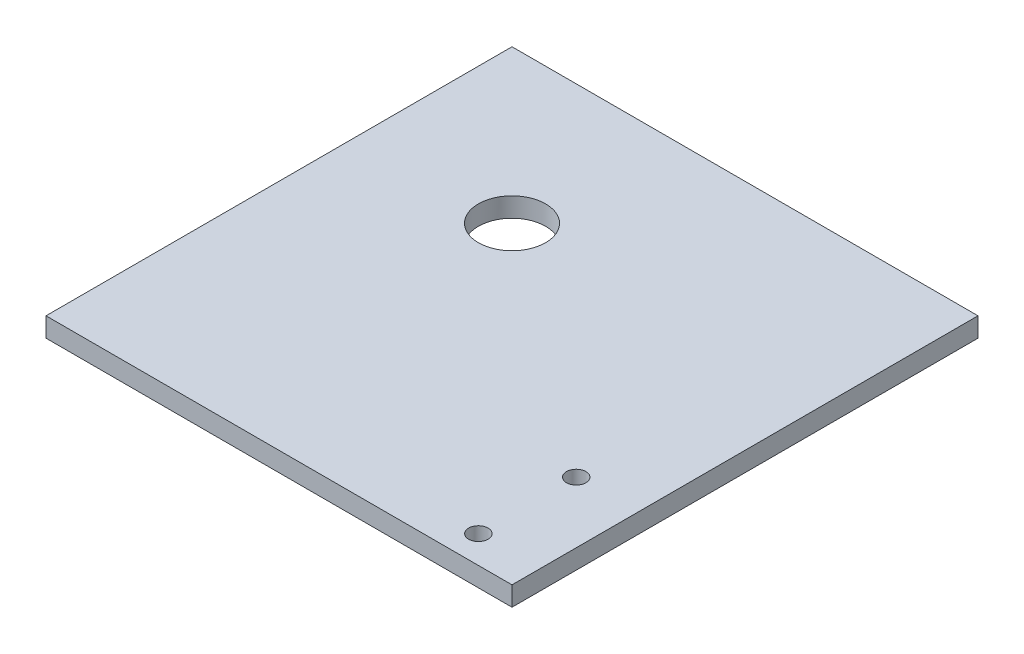
ISO-10303-21;
HEADER;
FILE_DESCRIPTION(('STEP AP214'),'2;1');
FILE_NAME('part.step','',(''),(''),'','','');
FILE_SCHEMA(('AUTOMOTIVE_DESIGN { 1 0 10303 214 1 1 1 1 }'));
ENDSEC;
DATA;
#1=APPLICATION_CONTEXT('core data for automotive mechanical design processes');
#2=APPLICATION_PROTOCOL_DEFINITION('international standard','automotive_design',2000,#1);
#3=PRODUCT_CONTEXT('',#1,'mechanical');
#4=PRODUCT('Part','Part','',(#3));
#5=PRODUCT_RELATED_PRODUCT_CATEGORY('part','',(#4));
#6=PRODUCT_DEFINITION_FORMATION('','',#4);
#7=PRODUCT_DEFINITION_CONTEXT('part definition',#1,'design');
#8=PRODUCT_DEFINITION('design','',#6,#7);
#9=PRODUCT_DEFINITION_SHAPE('','',#8);
#10=(LENGTH_UNIT() NAMED_UNIT(*) SI_UNIT(.MILLI.,.METRE.));
#11=(NAMED_UNIT(*) PLANE_ANGLE_UNIT() SI_UNIT($,.RADIAN.));
#12=(NAMED_UNIT(*) SI_UNIT($,.STERADIAN.) SOLID_ANGLE_UNIT());
#13=UNCERTAINTY_MEASURE_WITH_UNIT(LENGTH_MEASURE(1.E-05),#10,'distance_accuracy_value','');
#14=(GEOMETRIC_REPRESENTATION_CONTEXT(3) GLOBAL_UNCERTAINTY_ASSIGNED_CONTEXT((#13)) GLOBAL_UNIT_ASSIGNED_CONTEXT((#10,
#11,#12)) REPRESENTATION_CONTEXT('',''));
#15=CARTESIAN_POINT('',(0.,0.,0.));
#16=DIRECTION('',(0.,0.,1.));
#17=DIRECTION('',(1.,0.,0.));
#18=AXIS2_PLACEMENT_3D('',#15,#16,#17);
#19=CARTESIAN_POINT('',(0.,3.175,0.));
#20=DIRECTION('',(0.,-1.,0.));
#21=DIRECTION('',(0.,0.,-1.));
#22=AXIS2_PLACEMENT_3D('',#19,#20,#21);
#23=PLANE('',#22);
#24=DIRECTION('',(0.,0.,-1.));
#25=VECTOR('',#24,1.);
#26=CARTESIAN_POINT('',(76.2,3.175,76.2));
#27=LINE('',#26,#25);
#28=CARTESIAN_POINT('',(76.2,3.175,76.2));
#29=VERTEX_POINT('',#28);
#30=CARTESIAN_POINT('',(76.2,3.175,-76.2));
#31=VERTEX_POINT('',#30);
#32=EDGE_CURVE('E99',#29,#31,#27,.T.);
#33=ORIENTED_EDGE('',*,*,#32,.T.);
#34=DIRECTION('',(-1.,0.,0.));
#35=VECTOR('',#34,1.);
#36=CARTESIAN_POINT('',(-76.2,3.175,-76.2));
#37=LINE('',#36,#35);
#38=CARTESIAN_POINT('',(-76.2,3.175,-76.2));
#39=VERTEX_POINT('',#38);
#40=EDGE_CURVE('E94',#31,#39,#37,.T.);
#41=ORIENTED_EDGE('',*,*,#40,.T.);
#42=DIRECTION('',(0.,0.,1.));
#43=VECTOR('',#42,1.);
#44=CARTESIAN_POINT('',(-76.2,3.175,76.2));
#45=LINE('',#44,#43);
#46=CARTESIAN_POINT('',(-76.2,3.175,76.2));
#47=VERTEX_POINT('',#46);
#48=EDGE_CURVE('E97',#39,#47,#45,.T.);
#49=ORIENTED_EDGE('',*,*,#48,.T.);
#50=DIRECTION('',(1.,0.,0.));
#51=VECTOR('',#50,1.);
#52=CARTESIAN_POINT('',(-76.2,3.175,76.2));
#53=LINE('',#52,#51);
#54=EDGE_CURVE('E64',#47,#29,#53,.T.);
#55=ORIENTED_EDGE('',*,*,#54,.T.);
#56=EDGE_LOOP('',(#33,#41,#49,#55));
#57=FACE_BOUND('',#56,.T.);
#58=CARTESIAN_POINT('',(-26.2,3.175,-26.2));
#59=DIRECTION('',(0.,1.,0.));
#60=DIRECTION('',(0.,0.,1.));
#61=AXIS2_PLACEMENT_3D('',#58,#59,#60);
#62=CIRCLE('',#61,11.);
#63=CARTESIAN_POINT('',(-26.2,3.175,-15.2));
#64=VERTEX_POINT('',#63);
#65=EDGE_CURVE('E122',#64,#64,#62,.T.);
#66=ORIENTED_EDGE('',*,*,#65,.F.);
#67=EDGE_LOOP('',(#66));
#68=FACE_BOUND('',#67,.T.);
#69=CARTESIAN_POINT('',(56.2,3.175,67.2));
#70=DIRECTION('',(0.,1.,0.));
#71=DIRECTION('',(0.,0.,1.));
#72=AXIS2_PLACEMENT_3D('',#69,#70,#71);
#73=CIRCLE('',#72,3.175);
#74=CARTESIAN_POINT('',(56.2,3.175,70.375));
#75=VERTEX_POINT('',#74);
#76=EDGE_CURVE('E130',#75,#75,#73,.F.);
#77=ORIENTED_EDGE('',*,*,#76,.T.);
#78=EDGE_LOOP('',(#77));
#79=FACE_BOUND('',#78,.T.);
#80=CARTESIAN_POINT('',(56.2,3.175,35.2));
#81=DIRECTION('',(0.,1.,0.));
#82=DIRECTION('',(0.,0.,1.));
#83=AXIS2_PLACEMENT_3D('',#80,#81,#82);
#84=CIRCLE('',#83,3.175);
#85=CARTESIAN_POINT('',(56.2,3.175,38.375));
#86=VERTEX_POINT('',#85);
#87=EDGE_CURVE('E125',#86,#86,#84,.T.);
#88=ORIENTED_EDGE('',*,*,#87,.F.);
#89=EDGE_LOOP('',(#88));
#90=FACE_BOUND('',#89,.T.);
#91=ADVANCED_FACE('F45',(#57,#68,#79,#90),#23,.F.);
#92=CARTESIAN_POINT('',(0.,-3.175,0.));
#93=DIRECTION('',(0.,-1.,0.));
#94=DIRECTION('',(0.,0.,-1.));
#95=AXIS2_PLACEMENT_3D('',#92,#93,#94);
#96=PLANE('',#95);
#97=CARTESIAN_POINT('',(56.2,-3.175,67.2));
#98=DIRECTION('',(0.,-1.,0.));
#99=DIRECTION('',(0.,0.,-1.));
#100=AXIS2_PLACEMENT_3D('',#97,#98,#99);
#101=CIRCLE('',#100,3.175);
#102=CARTESIAN_POINT('',(56.2,-3.175,64.025));
#103=VERTEX_POINT('',#102);
#104=EDGE_CURVE('E123',#103,#103,#101,.F.);
#105=ORIENTED_EDGE('',*,*,#104,.T.);
#106=EDGE_LOOP('',(#105));
#107=FACE_BOUND('',#106,.T.);
#108=CARTESIAN_POINT('',(-26.2,-3.175,-26.2));
#109=DIRECTION('',(0.,-1.,0.));
#110=DIRECTION('',(0.,0.,-1.));
#111=AXIS2_PLACEMENT_3D('',#108,#109,#110);
#112=CIRCLE('',#111,11.);
#113=CARTESIAN_POINT('',(-26.2,-3.175,-37.2));
#114=VERTEX_POINT('',#113);
#115=EDGE_CURVE('E115',#114,#114,#112,.T.);
#116=ORIENTED_EDGE('',*,*,#115,.F.);
#117=EDGE_LOOP('',(#116));
#118=FACE_BOUND('',#117,.T.);
#119=DIRECTION('',(0.,0.,-1.));
#120=VECTOR('',#119,1.);
#121=CARTESIAN_POINT('',(76.2,-3.175,76.2));
#122=LINE('',#121,#120);
#123=CARTESIAN_POINT('',(76.2,-3.175,76.2));
#124=VERTEX_POINT('',#123);
#125=CARTESIAN_POINT('',(76.2,-3.175,-76.2));
#126=VERTEX_POINT('',#125);
#127=EDGE_CURVE('E112',#124,#126,#122,.T.);
#128=ORIENTED_EDGE('',*,*,#127,.F.);
#129=DIRECTION('',(1.,0.,0.));
#130=VECTOR('',#129,1.);
#131=CARTESIAN_POINT('',(-76.2,-3.175,76.2));
#132=LINE('',#131,#130);
#133=CARTESIAN_POINT('',(-76.2,-3.175,76.2));
#134=VERTEX_POINT('',#133);
#135=EDGE_CURVE('E87',#134,#124,#132,.T.);
#136=ORIENTED_EDGE('',*,*,#135,.F.);
#137=DIRECTION('',(0.,0.,1.));
#138=VECTOR('',#137,1.);
#139=CARTESIAN_POINT('',(-76.2,-3.175,76.2));
#140=LINE('',#139,#138);
#141=CARTESIAN_POINT('',(-76.2,-3.175,-76.2));
#142=VERTEX_POINT('',#141);
#143=EDGE_CURVE('E81',#142,#134,#140,.T.);
#144=ORIENTED_EDGE('',*,*,#143,.F.);
#145=DIRECTION('',(-1.,0.,0.));
#146=VECTOR('',#145,1.);
#147=CARTESIAN_POINT('',(-76.2,-3.175,-76.2));
#148=LINE('',#147,#146);
#149=EDGE_CURVE('E103',#126,#142,#148,.T.);
#150=ORIENTED_EDGE('',*,*,#149,.F.);
#151=EDGE_LOOP('',(#128,#136,#144,#150));
#152=FACE_BOUND('',#151,.T.);
#153=CARTESIAN_POINT('',(56.2,-3.175,35.2));
#154=DIRECTION('',(0.,-1.,0.));
#155=DIRECTION('',(0.,0.,-1.));
#156=AXIS2_PLACEMENT_3D('',#153,#154,#155);
#157=CIRCLE('',#156,3.175);
#158=CARTESIAN_POINT('',(56.2,-3.175,32.025));
#159=VERTEX_POINT('',#158);
#160=EDGE_CURVE('E49',#159,#159,#157,.T.);
#161=ORIENTED_EDGE('',*,*,#160,.F.);
#162=EDGE_LOOP('',(#161));
#163=FACE_BOUND('',#162,.T.);
#164=ADVANCED_FACE('F143',(#107,#118,#152,#163),#96,.T.);
#165=CARTESIAN_POINT('',(76.2,3.175,76.2));
#166=DIRECTION('',(-1.,0.,0.));
#167=DIRECTION('',(0.,0.,1.));
#168=AXIS2_PLACEMENT_3D('',#165,#166,#167);
#169=PLANE('',#168);
#170=ORIENTED_EDGE('',*,*,#127,.T.);
#171=DIRECTION('',(0.,-1.,0.));
#172=VECTOR('',#171,1.);
#173=CARTESIAN_POINT('',(76.2,3.175,-76.2));
#174=LINE('',#173,#172);
#175=EDGE_CURVE('E11',#31,#126,#174,.T.);
#176=ORIENTED_EDGE('',*,*,#175,.F.);
#177=ORIENTED_EDGE('',*,*,#32,.F.);
#178=DIRECTION('',(0.,-1.,0.));
#179=VECTOR('',#178,1.);
#180=CARTESIAN_POINT('',(76.2,3.175,76.2));
#181=LINE('',#180,#179);
#182=EDGE_CURVE('E108',#29,#124,#181,.T.);
#183=ORIENTED_EDGE('',*,*,#182,.T.);
#184=EDGE_LOOP('',(#170,#176,#177,#183));
#185=FACE_BOUND('',#184,.T.);
#186=ADVANCED_FACE('F47',(#185),#169,.F.);
#187=CARTESIAN_POINT('',(-76.2,3.175,-76.2));
#188=DIRECTION('',(0.,0.,1.));
#189=DIRECTION('',(1.,0.,0.));
#190=AXIS2_PLACEMENT_3D('',#187,#188,#189);
#191=PLANE('',#190);
#192=ORIENTED_EDGE('',*,*,#149,.T.);
#193=DIRECTION('',(0.,-1.,0.));
#194=VECTOR('',#193,1.);
#195=CARTESIAN_POINT('',(-76.2,3.175,-76.2));
#196=LINE('',#195,#194);
#197=EDGE_CURVE('E55',#39,#142,#196,.T.);
#198=ORIENTED_EDGE('',*,*,#197,.F.);
#199=ORIENTED_EDGE('',*,*,#40,.F.);
#200=ORIENTED_EDGE('',*,*,#175,.T.);
#201=EDGE_LOOP('',(#192,#198,#199,#200));
#202=FACE_BOUND('',#201,.T.);
#203=ADVANCED_FACE('F102',(#202),#191,.F.);
#204=CARTESIAN_POINT('',(-76.2,3.175,76.2));
#205=DIRECTION('',(1.,0.,0.));
#206=DIRECTION('',(0.,0.,-1.));
#207=AXIS2_PLACEMENT_3D('',#204,#205,#206);
#208=PLANE('',#207);
#209=ORIENTED_EDGE('',*,*,#143,.T.);
#210=DIRECTION('',(0.,-1.,0.));
#211=VECTOR('',#210,1.);
#212=CARTESIAN_POINT('',(-76.2,3.175,76.2));
#213=LINE('',#212,#211);
#214=EDGE_CURVE('E104',#47,#134,#213,.T.);
#215=ORIENTED_EDGE('',*,*,#214,.F.);
#216=ORIENTED_EDGE('',*,*,#48,.F.);
#217=ORIENTED_EDGE('',*,*,#197,.T.);
#218=EDGE_LOOP('',(#209,#215,#216,#217));
#219=FACE_BOUND('',#218,.T.);
#220=ADVANCED_FACE('F106',(#219),#208,.F.);
#221=CARTESIAN_POINT('',(-76.2,3.175,76.2));
#222=DIRECTION('',(0.,0.,-1.));
#223=DIRECTION('',(-1.,0.,0.));
#224=AXIS2_PLACEMENT_3D('',#221,#222,#223);
#225=PLANE('',#224);
#226=ORIENTED_EDGE('',*,*,#135,.T.);
#227=ORIENTED_EDGE('',*,*,#182,.F.);
#228=ORIENTED_EDGE('',*,*,#54,.F.);
#229=ORIENTED_EDGE('',*,*,#214,.T.);
#230=EDGE_LOOP('',(#226,#227,#228,#229));
#231=FACE_BOUND('',#230,.T.);
#232=ADVANCED_FACE('F160',(#231),#225,.F.);
#233=CARTESIAN_POINT('',(-26.2,-6.825,-26.2));
#234=DIRECTION('',(0.,1.,0.));
#235=DIRECTION('',(0.,0.,1.));
#236=AXIS2_PLACEMENT_3D('',#233,#234,#235);
#237=CYLINDRICAL_SURFACE('',#236,11.);
#238=ORIENTED_EDGE('',*,*,#115,.T.);
#239=EDGE_LOOP('',(#238));
#240=FACE_BOUND('',#239,.T.);
#241=ORIENTED_EDGE('',*,*,#65,.T.);
#242=EDGE_LOOP('',(#241));
#243=FACE_BOUND('',#242,.T.);
#244=ADVANCED_FACE('F140',(#240,#243),#237,.F.);
#245=CARTESIAN_POINT('',(56.2,-6.825,67.2));
#246=DIRECTION('',(0.,1.,0.));
#247=DIRECTION('',(0.,0.,1.));
#248=AXIS2_PLACEMENT_3D('',#245,#246,#247);
#249=CYLINDRICAL_SURFACE('',#248,3.175);
#250=ORIENTED_EDGE('',*,*,#104,.F.);
#251=EDGE_LOOP('',(#250));
#252=FACE_BOUND('',#251,.T.);
#253=ORIENTED_EDGE('',*,*,#76,.F.);
#254=EDGE_LOOP('',(#253));
#255=FACE_BOUND('',#254,.T.);
#256=ADVANCED_FACE('F148',(#252,#255),#249,.F.);
#257=CARTESIAN_POINT('',(56.2,-6.825,35.2));
#258=DIRECTION('',(0.,1.,0.));
#259=DIRECTION('',(0.,0.,1.));
#260=AXIS2_PLACEMENT_3D('',#257,#258,#259);
#261=CYLINDRICAL_SURFACE('',#260,3.175);
#262=ORIENTED_EDGE('',*,*,#160,.T.);
#263=EDGE_LOOP('',(#262));
#264=FACE_BOUND('',#263,.T.);
#265=ORIENTED_EDGE('',*,*,#87,.T.);
#266=EDGE_LOOP('',(#265));
#267=FACE_BOUND('',#266,.T.);
#268=ADVANCED_FACE('F150',(#264,#267),#261,.F.);
#269=CLOSED_SHELL('',(#91,#164,#186,#203,#220,#232,#244,#256,#268));
#270=MANIFOLD_SOLID_BREP('B2',#269);
#271=ADVANCED_BREP_SHAPE_REPRESENTATION('',(#18,#270),#14);
#272=SHAPE_DEFINITION_REPRESENTATION(#9,#271);
ENDSEC;
END-ISO-10303-21;
